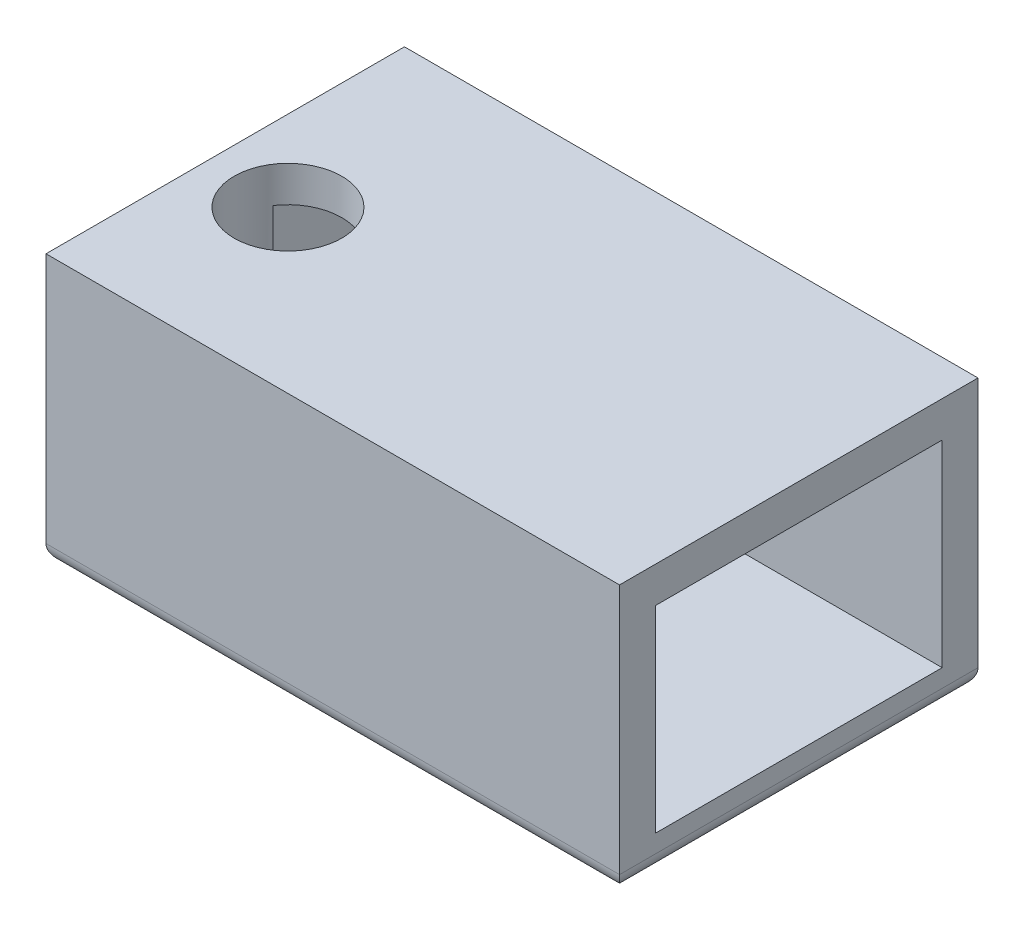
ISO-10303-21;
HEADER;
FILE_DESCRIPTION(('STEP AP214'),'2;1');
FILE_NAME('part.step','',(''),(''),'','','');
FILE_SCHEMA(('AUTOMOTIVE_DESIGN { 1 0 10303 214 1 1 1 1 }'));
ENDSEC;
DATA;
#1=APPLICATION_CONTEXT('core data for automotive mechanical design processes');
#2=APPLICATION_PROTOCOL_DEFINITION('international standard','automotive_design',2000,#1);
#3=PRODUCT_CONTEXT('',#1,'mechanical');
#4=PRODUCT('Part','Part','',(#3));
#5=PRODUCT_RELATED_PRODUCT_CATEGORY('part','',(#4));
#6=PRODUCT_DEFINITION_FORMATION('','',#4);
#7=PRODUCT_DEFINITION_CONTEXT('part definition',#1,'design');
#8=PRODUCT_DEFINITION('design','',#6,#7);
#9=PRODUCT_DEFINITION_SHAPE('','',#8);
#10=(LENGTH_UNIT() NAMED_UNIT(*) SI_UNIT(.MILLI.,.METRE.));
#11=(NAMED_UNIT(*) PLANE_ANGLE_UNIT() SI_UNIT($,.RADIAN.));
#12=(NAMED_UNIT(*) SI_UNIT($,.STERADIAN.) SOLID_ANGLE_UNIT());
#13=UNCERTAINTY_MEASURE_WITH_UNIT(LENGTH_MEASURE(1.E-05),#10,'distance_accuracy_value','');
#14=(GEOMETRIC_REPRESENTATION_CONTEXT(3) GLOBAL_UNCERTAINTY_ASSIGNED_CONTEXT((#13)) GLOBAL_UNIT_ASSIGNED_CONTEXT((#10,
#11,#12)) REPRESENTATION_CONTEXT('',''));
#15=CARTESIAN_POINT('',(0.,0.,0.));
#16=DIRECTION('',(0.,0.,1.));
#17=DIRECTION('',(1.,0.,0.));
#18=AXIS2_PLACEMENT_3D('',#15,#16,#17);
#19=CARTESIAN_POINT('',(-15.,11.,8.));
#20=DIRECTION('',(1.,0.,0.));
#21=DIRECTION('',(0.,0.,-1.));
#22=AXIS2_PLACEMENT_3D('',#19,#20,#21);
#23=PLANE('',#22);
#24=DIRECTION('',(0.,1.,0.));
#25=VECTOR('',#24,1.);
#26=CARTESIAN_POINT('',(-15.,-8.48528137423857,-0.658312395177701));
#27=LINE('',#26,#25);
#28=CARTESIAN_POINT('',(-15.,0.,-0.658312395177701));
#29=VERTEX_POINT('',#28);
#30=CARTESIAN_POINT('',(-15.,11.,-0.658312395177701));
#31=VERTEX_POINT('',#30);
#32=EDGE_CURVE('E127',#29,#31,#27,.T.);
#33=ORIENTED_EDGE('',*,*,#32,.F.);
#34=DIRECTION('',(0.,0.,1.));
#35=VECTOR('',#34,1.);
#36=CARTESIAN_POINT('',(-15.,0.,8.));
#37=LINE('',#36,#35);
#38=CARTESIAN_POINT('',(-15.,0.,-8.));
#39=VERTEX_POINT('',#38);
#40=EDGE_CURVE('E141',#39,#29,#37,.T.);
#41=ORIENTED_EDGE('',*,*,#40,.F.);
#42=DIRECTION('',(0.,-1.,0.));
#43=VECTOR('',#42,1.);
#44=CARTESIAN_POINT('',(-15.,11.,-8.));
#45=LINE('',#44,#43);
#46=CARTESIAN_POINT('',(-15.,11.,-8.));
#47=VERTEX_POINT('',#46);
#48=EDGE_CURVE('E165',#47,#39,#45,.T.);
#49=ORIENTED_EDGE('',*,*,#48,.F.);
#50=DIRECTION('',(0.,0.,1.));
#51=VECTOR('',#50,1.);
#52=CARTESIAN_POINT('',(-15.,11.,8.));
#53=LINE('',#52,#51);
#54=EDGE_CURVE('E143',#47,#31,#53,.T.);
#55=ORIENTED_EDGE('',*,*,#54,.T.);
#56=EDGE_LOOP('',(#33,#41,#49,#55));
#57=FACE_BOUND('',#56,.T.);
#58=ADVANCED_FACE('F33',(#57),#23,.T.);
#59=CARTESIAN_POINT('',(15.,11.,8.));
#60=DIRECTION('',(-1.,0.,0.));
#61=DIRECTION('',(0.,0.,1.));
#62=AXIS2_PLACEMENT_3D('',#59,#60,#61);
#63=PLANE('',#62);
#64=DIRECTION('',(0.,-1.,0.));
#65=VECTOR('',#64,1.);
#66=CARTESIAN_POINT('',(15.,11.,10.));
#67=LINE('',#66,#65);
#68=CARTESIAN_POINT('',(15.,13.,10.));
#69=VERTEX_POINT('',#68);
#70=CARTESIAN_POINT('',(15.,-1.,10.));
#71=VERTEX_POINT('',#70);
#72=EDGE_CURVE('E180',#69,#71,#67,.T.);
#73=ORIENTED_EDGE('',*,*,#72,.T.);
#74=DIRECTION('',(0.,0.,-1.));
#75=VECTOR('',#74,1.);
#76=CARTESIAN_POINT('',(15.,-1.,-10.));
#77=LINE('',#76,#75);
#78=CARTESIAN_POINT('',(15.,-1.,-10.));
#79=VERTEX_POINT('',#78);
#80=EDGE_CURVE('E42',#71,#79,#77,.T.);
#81=ORIENTED_EDGE('',*,*,#80,.T.);
#82=DIRECTION('',(0.,-1.,0.));
#83=VECTOR('',#82,1.);
#84=CARTESIAN_POINT('',(15.,11.,-10.));
#85=LINE('',#84,#83);
#86=CARTESIAN_POINT('',(15.,13.,-10.));
#87=VERTEX_POINT('',#86);
#88=EDGE_CURVE('E174',#87,#79,#85,.T.);
#89=ORIENTED_EDGE('',*,*,#88,.F.);
#90=DIRECTION('',(0.,0.,-1.));
#91=VECTOR('',#90,1.);
#92=CARTESIAN_POINT('',(15.,13.,0.));
#93=LINE('',#92,#91);
#94=EDGE_CURVE('E170',#69,#87,#93,.T.);
#95=ORIENTED_EDGE('',*,*,#94,.F.);
#96=EDGE_LOOP('',(#73,#81,#89,#95));
#97=FACE_BOUND('',#96,.T.);
#98=DIRECTION('',(0.,0.,-1.));
#99=VECTOR('',#98,1.);
#100=CARTESIAN_POINT('',(15.,0.,8.));
#101=LINE('',#100,#99);
#102=CARTESIAN_POINT('',(15.,0.,8.));
#103=VERTEX_POINT('',#102);
#104=CARTESIAN_POINT('',(15.,0.,-8.));
#105=VERTEX_POINT('',#104);
#106=EDGE_CURVE('E144',#103,#105,#101,.T.);
#107=ORIENTED_EDGE('',*,*,#106,.F.);
#108=DIRECTION('',(0.,-1.,0.));
#109=VECTOR('',#108,1.);
#110=CARTESIAN_POINT('',(15.,11.,8.));
#111=LINE('',#110,#109);
#112=CARTESIAN_POINT('',(15.,11.,8.));
#113=VERTEX_POINT('',#112);
#114=EDGE_CURVE('E158',#113,#103,#111,.T.);
#115=ORIENTED_EDGE('',*,*,#114,.F.);
#116=DIRECTION('',(0.,0.,-1.));
#117=VECTOR('',#116,1.);
#118=CARTESIAN_POINT('',(15.,11.,8.));
#119=LINE('',#118,#117);
#120=CARTESIAN_POINT('',(15.,11.,-8.));
#121=VERTEX_POINT('',#120);
#122=EDGE_CURVE('E153',#113,#121,#119,.T.);
#123=ORIENTED_EDGE('',*,*,#122,.T.);
#124=DIRECTION('',(0.,-1.,0.));
#125=VECTOR('',#124,1.);
#126=CARTESIAN_POINT('',(15.,11.,-8.));
#127=LINE('',#126,#125);
#128=EDGE_CURVE('E167',#121,#105,#127,.T.);
#129=ORIENTED_EDGE('',*,*,#128,.T.);
#130=EDGE_LOOP('',(#107,#115,#123,#129));
#131=FACE_BOUND('',#130,.T.);
#132=ADVANCED_FACE('F234',(#97,#131),#63,.F.);
#133=CARTESIAN_POINT('',(-15.,11.,-10.));
#134=DIRECTION('',(0.,0.,1.));
#135=DIRECTION('',(1.,0.,0.));
#136=AXIS2_PLACEMENT_3D('',#133,#134,#135);
#137=PLANE('',#136);
#138=ORIENTED_EDGE('',*,*,#88,.T.);
#139=DIRECTION('',(-1.,0.,0.));
#140=VECTOR('',#139,1.);
#141=CARTESIAN_POINT('',(-17.,-1.,-10.));
#142=LINE('',#141,#140);
#143=CARTESIAN_POINT('',(-17.,-1.,-10.));
#144=VERTEX_POINT('',#143);
#145=EDGE_CURVE('E200',#79,#144,#142,.T.);
#146=ORIENTED_EDGE('',*,*,#145,.T.);
#147=DIRECTION('',(0.,-1.,0.));
#148=VECTOR('',#147,1.);
#149=CARTESIAN_POINT('',(-17.,11.,-10.));
#150=LINE('',#149,#148);
#151=CARTESIAN_POINT('',(-17.,13.,-10.));
#152=VERTEX_POINT('',#151);
#153=EDGE_CURVE('E171',#152,#144,#150,.T.);
#154=ORIENTED_EDGE('',*,*,#153,.F.);
#155=DIRECTION('',(-1.,0.,0.));
#156=VECTOR('',#155,1.);
#157=CARTESIAN_POINT('',(0.,13.,-10.));
#158=LINE('',#157,#156);
#159=EDGE_CURVE('E176',#87,#152,#158,.T.);
#160=ORIENTED_EDGE('',*,*,#159,.F.);
#161=EDGE_LOOP('',(#138,#146,#154,#160));
#162=FACE_BOUND('',#161,.T.);
#163=ADVANCED_FACE('F259',(#162),#137,.F.);
#164=CARTESIAN_POINT('',(-17.,11.,8.));
#165=DIRECTION('',(1.,0.,0.));
#166=DIRECTION('',(0.,0.,-1.));
#167=AXIS2_PLACEMENT_3D('',#164,#165,#166);
#168=PLANE('',#167);
#169=ORIENTED_EDGE('',*,*,#153,.T.);
#170=DIRECTION('',(0.,0.,1.));
#171=VECTOR('',#170,1.);
#172=CARTESIAN_POINT('',(-17.,-1.,10.));
#173=LINE('',#172,#171);
#174=CARTESIAN_POINT('',(-17.,-1.,10.));
#175=VERTEX_POINT('',#174);
#176=EDGE_CURVE('E185',#144,#175,#173,.T.);
#177=ORIENTED_EDGE('',*,*,#176,.T.);
#178=DIRECTION('',(0.,-1.,0.));
#179=VECTOR('',#178,1.);
#180=CARTESIAN_POINT('',(-17.,11.,10.));
#181=LINE('',#180,#179);
#182=CARTESIAN_POINT('',(-17.,13.,10.));
#183=VERTEX_POINT('',#182);
#184=EDGE_CURVE('E175',#183,#175,#181,.T.);
#185=ORIENTED_EDGE('',*,*,#184,.F.);
#186=DIRECTION('',(0.,0.,1.));
#187=VECTOR('',#186,1.);
#188=CARTESIAN_POINT('',(-17.,13.,0.));
#189=LINE('',#188,#187);
#190=EDGE_CURVE('E178',#152,#183,#189,.T.);
#191=ORIENTED_EDGE('',*,*,#190,.F.);
#192=EDGE_LOOP('',(#169,#177,#185,#191));
#193=FACE_BOUND('',#192,.T.);
#194=ADVANCED_FACE('F267',(#193),#168,.F.);
#195=CARTESIAN_POINT('',(-15.,11.,10.));
#196=DIRECTION('',(0.,0.,-1.));
#197=DIRECTION('',(-1.,0.,0.));
#198=AXIS2_PLACEMENT_3D('',#195,#196,#197);
#199=PLANE('',#198);
#200=ORIENTED_EDGE('',*,*,#184,.T.);
#201=DIRECTION('',(1.,0.,0.));
#202=VECTOR('',#201,1.);
#203=CARTESIAN_POINT('',(15.,-1.,10.));
#204=LINE('',#203,#202);
#205=EDGE_CURVE('E11',#175,#71,#204,.T.);
#206=ORIENTED_EDGE('',*,*,#205,.T.);
#207=ORIENTED_EDGE('',*,*,#72,.F.);
#208=DIRECTION('',(1.,0.,0.));
#209=VECTOR('',#208,1.);
#210=CARTESIAN_POINT('',(0.,13.,10.));
#211=LINE('',#210,#209);
#212=EDGE_CURVE('E182',#183,#69,#211,.T.);
#213=ORIENTED_EDGE('',*,*,#212,.F.);
#214=EDGE_LOOP('',(#200,#206,#207,#213));
#215=FACE_BOUND('',#214,.T.);
#216=ADVANCED_FACE('F271',(#215),#199,.F.);
#217=CARTESIAN_POINT('',(0.,13.,0.));
#218=DIRECTION('',(0.,-1.,0.));
#219=DIRECTION('',(0.,0.,-1.));
#220=AXIS2_PLACEMENT_3D('',#217,#218,#219);
#221=PLANE('',#220);
#222=CARTESIAN_POINT('',(-12.5,13.,1.));
#223=DIRECTION('',(0.,1.,0.));
#224=DIRECTION('',(0.,0.,1.));
#225=AXIS2_PLACEMENT_3D('',#222,#223,#224);
#226=CIRCLE('',#225,3.);
#227=CARTESIAN_POINT('',(-12.5,13.,4.));
#228=VERTEX_POINT('',#227);
#229=EDGE_CURVE('E135',#228,#228,#226,.T.);
#230=ORIENTED_EDGE('',*,*,#229,.F.);
#231=EDGE_LOOP('',(#230));
#232=FACE_BOUND('',#231,.T.);
#233=ORIENTED_EDGE('',*,*,#94,.T.);
#234=ORIENTED_EDGE('',*,*,#159,.T.);
#235=ORIENTED_EDGE('',*,*,#190,.T.);
#236=ORIENTED_EDGE('',*,*,#212,.T.);
#237=EDGE_LOOP('',(#233,#234,#235,#236));
#238=FACE_BOUND('',#237,.T.);
#239=ADVANCED_FACE('F275',(#232,#238),#221,.F.);
#240=CARTESIAN_POINT('',(0.,-2.,0.));
#241=DIRECTION('',(0.,-1.,0.));
#242=DIRECTION('',(0.,0.,-1.));
#243=AXIS2_PLACEMENT_3D('',#240,#241,#242);
#244=PLANE('',#243);
#245=DIRECTION('',(1.,0.,0.));
#246=VECTOR('',#245,1.);
#247=CARTESIAN_POINT('',(-17.,-2.,9.));
#248=LINE('',#247,#246);
#249=CARTESIAN_POINT('',(14.,-2.,9.));
#250=VERTEX_POINT('',#249);
#251=CARTESIAN_POINT('',(-16.,-2.,9.));
#252=VERTEX_POINT('',#251);
#253=EDGE_CURVE('E191',#250,#252,#248,.F.);
#254=ORIENTED_EDGE('',*,*,#253,.T.);
#255=DIRECTION('',(0.,0.,1.));
#256=VECTOR('',#255,1.);
#257=CARTESIAN_POINT('',(-16.,-2.,-10.));
#258=LINE('',#257,#256);
#259=CARTESIAN_POINT('',(-16.,-2.,-9.));
#260=VERTEX_POINT('',#259);
#261=EDGE_CURVE('E197',#252,#260,#258,.F.);
#262=ORIENTED_EDGE('',*,*,#261,.T.);
#263=DIRECTION('',(-1.,0.,0.));
#264=VECTOR('',#263,1.);
#265=CARTESIAN_POINT('',(15.,-2.,-9.));
#266=LINE('',#265,#264);
#267=CARTESIAN_POINT('',(14.,-2.,-9.));
#268=VERTEX_POINT('',#267);
#269=EDGE_CURVE('E195',#260,#268,#266,.F.);
#270=ORIENTED_EDGE('',*,*,#269,.T.);
#271=DIRECTION('',(0.,0.,-1.));
#272=VECTOR('',#271,1.);
#273=CARTESIAN_POINT('',(14.,-2.,10.));
#274=LINE('',#273,#272);
#275=EDGE_CURVE('E193',#268,#250,#274,.F.);
#276=ORIENTED_EDGE('',*,*,#275,.T.);
#277=EDGE_LOOP('',(#254,#262,#270,#276));
#278=FACE_BOUND('',#277,.T.);
#279=ADVANCED_FACE('F263',(#278),#244,.T.);
#280=CARTESIAN_POINT('',(-15.,11.,-8.));
#281=DIRECTION('',(0.,0.,1.));
#282=DIRECTION('',(1.,0.,0.));
#283=AXIS2_PLACEMENT_3D('',#280,#281,#282);
#284=PLANE('',#283);
#285=DIRECTION('',(-1.,0.,0.));
#286=VECTOR('',#285,1.);
#287=CARTESIAN_POINT('',(-15.,0.,-8.));
#288=LINE('',#287,#286);
#289=EDGE_CURVE('E148',#105,#39,#288,.T.);
#290=ORIENTED_EDGE('',*,*,#289,.F.);
#291=ORIENTED_EDGE('',*,*,#128,.F.);
#292=DIRECTION('',(-1.,0.,0.));
#293=VECTOR('',#292,1.);
#294=CARTESIAN_POINT('',(-15.,11.,-8.));
#295=LINE('',#294,#293);
#296=EDGE_CURVE('E224',#121,#47,#295,.T.);
#297=ORIENTED_EDGE('',*,*,#296,.T.);
#298=ORIENTED_EDGE('',*,*,#48,.T.);
#299=EDGE_LOOP('',(#290,#291,#297,#298));
#300=FACE_BOUND('',#299,.T.);
#301=ADVANCED_FACE('F236',(#300),#284,.T.);
#302=DIRECTION('',(0.,1.,0.));
#303=VECTOR('',#302,1.);
#304=CARTESIAN_POINT('',(-15.,-8.48528137423857,2.6583123951777));
#305=LINE('',#304,#303);
#306=CARTESIAN_POINT('',(-15.,11.,2.6583123951777));
#307=VERTEX_POINT('',#306);
#308=CARTESIAN_POINT('',(-15.,0.,2.6583123951777));
#309=VERTEX_POINT('',#308);
#310=EDGE_CURVE('E130',#307,#309,#305,.F.);
#311=ORIENTED_EDGE('',*,*,#310,.F.);
#312=CARTESIAN_POINT('',(-15.,11.,8.));
#313=VERTEX_POINT('',#312);
#314=EDGE_CURVE('E226',#307,#313,#53,.T.);
#315=ORIENTED_EDGE('',*,*,#314,.T.);
#316=DIRECTION('',(0.,-1.,0.));
#317=VECTOR('',#316,1.);
#318=CARTESIAN_POINT('',(-15.,11.,8.));
#319=LINE('',#318,#317);
#320=CARTESIAN_POINT('',(-15.,0.,8.));
#321=VERTEX_POINT('',#320);
#322=EDGE_CURVE('E161',#313,#321,#319,.T.);
#323=ORIENTED_EDGE('',*,*,#322,.T.);
#324=EDGE_CURVE('E151',#309,#321,#37,.T.);
#325=ORIENTED_EDGE('',*,*,#324,.F.);
#326=EDGE_LOOP('',(#311,#315,#323,#325));
#327=FACE_BOUND('',#326,.T.);
#328=ADVANCED_FACE('F242',(#327),#23,.T.);
#329=CARTESIAN_POINT('',(-15.,11.,8.));
#330=DIRECTION('',(0.,0.,-1.));
#331=DIRECTION('',(-1.,0.,0.));
#332=AXIS2_PLACEMENT_3D('',#329,#330,#331);
#333=PLANE('',#332);
#334=DIRECTION('',(1.,0.,0.));
#335=VECTOR('',#334,1.);
#336=CARTESIAN_POINT('',(-15.,0.,8.));
#337=LINE('',#336,#335);
#338=EDGE_CURVE('E150',#321,#103,#337,.T.);
#339=ORIENTED_EDGE('',*,*,#338,.F.);
#340=ORIENTED_EDGE('',*,*,#322,.F.);
#341=DIRECTION('',(1.,0.,0.));
#342=VECTOR('',#341,1.);
#343=CARTESIAN_POINT('',(-15.,11.,8.));
#344=LINE('',#343,#342);
#345=EDGE_CURVE('E162',#313,#113,#344,.T.);
#346=ORIENTED_EDGE('',*,*,#345,.T.);
#347=ORIENTED_EDGE('',*,*,#114,.T.);
#348=EDGE_LOOP('',(#339,#340,#346,#347));
#349=FACE_BOUND('',#348,.T.);
#350=ADVANCED_FACE('F245',(#349),#333,.T.);
#351=CARTESIAN_POINT('',(0.,11.,0.));
#352=DIRECTION('',(0.,-1.,0.));
#353=DIRECTION('',(0.,0.,-1.));
#354=AXIS2_PLACEMENT_3D('',#351,#352,#353);
#355=PLANE('',#354);
#356=CARTESIAN_POINT('',(-12.5,11.,1.));
#357=DIRECTION('',(0.,-1.,0.));
#358=DIRECTION('',(0.,0.,-1.));
#359=AXIS2_PLACEMENT_3D('',#356,#357,#358);
#360=CIRCLE('',#359,3.);
#361=EDGE_CURVE('E134',#31,#307,#360,.T.);
#362=ORIENTED_EDGE('',*,*,#361,.F.);
#363=ORIENTED_EDGE('',*,*,#54,.F.);
#364=ORIENTED_EDGE('',*,*,#296,.F.);
#365=ORIENTED_EDGE('',*,*,#122,.F.);
#366=ORIENTED_EDGE('',*,*,#345,.F.);
#367=ORIENTED_EDGE('',*,*,#314,.F.);
#368=EDGE_LOOP('',(#362,#363,#364,#365,#366,#367));
#369=FACE_BOUND('',#368,.T.);
#370=ADVANCED_FACE('F238',(#369),#355,.T.);
#371=CARTESIAN_POINT('',(0.,0.,0.));
#372=DIRECTION('',(0.,-1.,0.));
#373=DIRECTION('',(0.,0.,-1.));
#374=AXIS2_PLACEMENT_3D('',#371,#372,#373);
#375=PLANE('',#374);
#376=ORIENTED_EDGE('',*,*,#40,.T.);
#377=CARTESIAN_POINT('',(-12.5,0.,1.));
#378=DIRECTION('',(0.,-1.,0.));
#379=DIRECTION('',(0.,0.,-1.));
#380=AXIS2_PLACEMENT_3D('',#377,#378,#379);
#381=CIRCLE('',#380,3.);
#382=EDGE_CURVE('E123',#29,#309,#381,.F.);
#383=ORIENTED_EDGE('',*,*,#382,.T.);
#384=ORIENTED_EDGE('',*,*,#324,.T.);
#385=ORIENTED_EDGE('',*,*,#338,.T.);
#386=ORIENTED_EDGE('',*,*,#106,.T.);
#387=ORIENTED_EDGE('',*,*,#289,.T.);
#388=EDGE_LOOP('',(#376,#383,#384,#385,#386,#387));
#389=FACE_BOUND('',#388,.T.);
#390=ADVANCED_FACE('F146',(#389),#375,.F.);
#391=CARTESIAN_POINT('',(-12.5,-8.48528137423857,1.));
#392=DIRECTION('',(0.,1.,0.));
#393=DIRECTION('',(0.,0.,1.));
#394=AXIS2_PLACEMENT_3D('',#391,#392,#393);
#395=CYLINDRICAL_SURFACE('',#394,3.);
#396=ORIENTED_EDGE('',*,*,#32,.T.);
#397=ORIENTED_EDGE('',*,*,#361,.T.);
#398=ORIENTED_EDGE('',*,*,#310,.T.);
#399=ORIENTED_EDGE('',*,*,#382,.F.);
#400=EDGE_LOOP('',(#396,#397,#398,#399));
#401=FACE_BOUND('',#400,.T.);
#402=ORIENTED_EDGE('',*,*,#229,.T.);
#403=EDGE_LOOP('',(#402));
#404=FACE_BOUND('',#403,.T.);
#405=ADVANCED_FACE('F125',(#401,#404),#395,.F.);
#406=CARTESIAN_POINT('',(14.,-1.,8.));
#407=DIRECTION('',(0.,0.,1.));
#408=DIRECTION('',(1.,0.,0.));
#409=AXIS2_PLACEMENT_3D('',#406,#407,#408);
#410=CYLINDRICAL_SURFACE('',#409,1.);
#411=CARTESIAN_POINT('',(14.,-1.,9.));
#412=DIRECTION('',(-0.707106781186547,0.,0.707106781186547));
#413=DIRECTION('',(-0.707106781186547,0.,-0.707106781186547));
#414=AXIS2_PLACEMENT_3D('',#411,#412,#413);
#415=ELLIPSE('',#414,1.41421356237309,1.);
#416=EDGE_CURVE('E206',#250,#71,#415,.T.);
#417=ORIENTED_EDGE('',*,*,#416,.F.);
#418=ORIENTED_EDGE('',*,*,#275,.F.);
#419=CARTESIAN_POINT('',(14.,-1.,-9.));
#420=DIRECTION('',(0.707106781186547,0.,0.707106781186547));
#421=DIRECTION('',(-0.707106781186547,0.,0.707106781186547));
#422=AXIS2_PLACEMENT_3D('',#419,#420,#421);
#423=ELLIPSE('',#422,1.41421356237309,1.);
#424=EDGE_CURVE('E37',#79,#268,#423,.F.);
#425=ORIENTED_EDGE('',*,*,#424,.F.);
#426=ORIENTED_EDGE('',*,*,#80,.F.);
#427=EDGE_LOOP('',(#417,#418,#425,#426));
#428=FACE_BOUND('',#427,.T.);
#429=ADVANCED_FACE('F35',(#428),#410,.T.);
#430=CARTESIAN_POINT('',(-15.,-1.,-9.));
#431=DIRECTION('',(1.,0.,0.));
#432=DIRECTION('',(0.,0.,-1.));
#433=AXIS2_PLACEMENT_3D('',#430,#431,#432);
#434=CYLINDRICAL_SURFACE('',#433,1.);
#435=ORIENTED_EDGE('',*,*,#424,.T.);
#436=ORIENTED_EDGE('',*,*,#269,.F.);
#437=CARTESIAN_POINT('',(-16.,-1.,-9.));
#438=DIRECTION('',(0.707106781186547,0.,-0.707106781186547));
#439=DIRECTION('',(0.707106781186547,0.,0.707106781186547));
#440=AXIS2_PLACEMENT_3D('',#437,#438,#439);
#441=ELLIPSE('',#440,1.41421356237309,1.);
#442=EDGE_CURVE('E205',#144,#260,#441,.F.);
#443=ORIENTED_EDGE('',*,*,#442,.F.);
#444=ORIENTED_EDGE('',*,*,#145,.F.);
#445=EDGE_LOOP('',(#435,#436,#443,#444));
#446=FACE_BOUND('',#445,.T.);
#447=ADVANCED_FACE('F288',(#446),#434,.T.);
#448=CARTESIAN_POINT('',(-15.,-1.,9.));
#449=DIRECTION('',(-1.,0.,0.));
#450=DIRECTION('',(0.,0.,1.));
#451=AXIS2_PLACEMENT_3D('',#448,#449,#450);
#452=CYLINDRICAL_SURFACE('',#451,1.);
#453=ORIENTED_EDGE('',*,*,#416,.T.);
#454=ORIENTED_EDGE('',*,*,#205,.F.);
#455=CARTESIAN_POINT('',(-16.,-1.,9.));
#456=DIRECTION('',(-0.707106781186547,0.,-0.707106781186547));
#457=DIRECTION('',(-0.707106781186547,0.,0.707106781186547));
#458=AXIS2_PLACEMENT_3D('',#455,#456,#457);
#459=ELLIPSE('',#458,1.41421356237309,1.);
#460=EDGE_CURVE('E203',#252,#175,#459,.T.);
#461=ORIENTED_EDGE('',*,*,#460,.F.);
#462=ORIENTED_EDGE('',*,*,#253,.F.);
#463=EDGE_LOOP('',(#453,#454,#461,#462));
#464=FACE_BOUND('',#463,.T.);
#465=ADVANCED_FACE('F285',(#464),#452,.T.);
#466=CARTESIAN_POINT('',(-16.,-1.,8.));
#467=DIRECTION('',(0.,0.,-1.));
#468=DIRECTION('',(-1.,0.,0.));
#469=AXIS2_PLACEMENT_3D('',#466,#467,#468);
#470=CYLINDRICAL_SURFACE('',#469,1.);
#471=ORIENTED_EDGE('',*,*,#442,.T.);
#472=ORIENTED_EDGE('',*,*,#261,.F.);
#473=ORIENTED_EDGE('',*,*,#460,.T.);
#474=ORIENTED_EDGE('',*,*,#176,.F.);
#475=EDGE_LOOP('',(#471,#472,#473,#474));
#476=FACE_BOUND('',#475,.T.);
#477=ADVANCED_FACE('F282',(#476),#470,.T.);
#478=CLOSED_SHELL('',(#58,#132,#163,#194,#216,#239,#279,#301,#328,#350,#370,#390,#405,#429,#447,
#465,#477));
#479=MANIFOLD_SOLID_BREP('B2',#478);
#480=ADVANCED_BREP_SHAPE_REPRESENTATION('',(#18,#479),#14);
#481=SHAPE_DEFINITION_REPRESENTATION(#9,#480);
ENDSEC;
END-ISO-10303-21;
